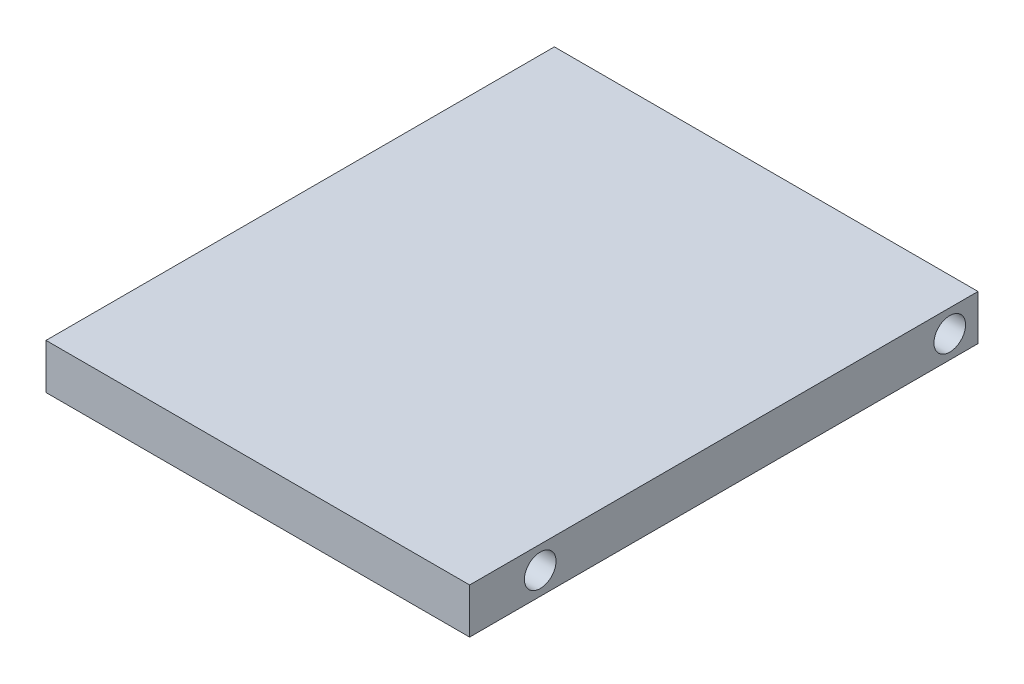
ISO-10303-21;
HEADER;
FILE_DESCRIPTION(('STEP AP214'),'2;1');
FILE_NAME('part.step','',(''),(''),'','','');
FILE_SCHEMA(('AUTOMOTIVE_DESIGN { 1 0 10303 214 1 1 1 1 }'));
ENDSEC;
DATA;
#1=APPLICATION_CONTEXT('core data for automotive mechanical design processes');
#2=APPLICATION_PROTOCOL_DEFINITION('international standard','automotive_design',2000,#1);
#3=PRODUCT_CONTEXT('',#1,'mechanical');
#4=PRODUCT('Part','Part','',(#3));
#5=PRODUCT_RELATED_PRODUCT_CATEGORY('part','',(#4));
#6=PRODUCT_DEFINITION_FORMATION('','',#4);
#7=PRODUCT_DEFINITION_CONTEXT('part definition',#1,'design');
#8=PRODUCT_DEFINITION('design','',#6,#7);
#9=PRODUCT_DEFINITION_SHAPE('','',#8);
#10=(LENGTH_UNIT() NAMED_UNIT(*) SI_UNIT(.MILLI.,.METRE.));
#11=(NAMED_UNIT(*) PLANE_ANGLE_UNIT() SI_UNIT($,.RADIAN.));
#12=(NAMED_UNIT(*) SI_UNIT($,.STERADIAN.) SOLID_ANGLE_UNIT());
#13=UNCERTAINTY_MEASURE_WITH_UNIT(LENGTH_MEASURE(1.E-05),#10,'distance_accuracy_value','');
#14=(GEOMETRIC_REPRESENTATION_CONTEXT(3) GLOBAL_UNCERTAINTY_ASSIGNED_CONTEXT((#13)) GLOBAL_UNIT_ASSIGNED_CONTEXT((#10,
#11,#12)) REPRESENTATION_CONTEXT('',''));
#15=CARTESIAN_POINT('',(0.,0.,0.));
#16=DIRECTION('',(0.,0.,1.));
#17=DIRECTION('',(1.,0.,0.));
#18=AXIS2_PLACEMENT_3D('',#15,#16,#17);
#19=CARTESIAN_POINT('',(-37.5,8.,-45.));
#20=DIRECTION('',(1.,0.,0.));
#21=DIRECTION('',(0.,0.,-1.));
#22=AXIS2_PLACEMENT_3D('',#19,#20,#21);
#23=PLANE('',#22);
#24=CARTESIAN_POINT('',(-37.5,4.,-40.));
#25=DIRECTION('',(1.,0.,0.));
#26=DIRECTION('',(0.,0.,-1.));
#27=AXIS2_PLACEMENT_3D('',#24,#25,#26);
#28=CIRCLE('',#27,2.8);
#29=CARTESIAN_POINT('',(-37.5,4.,-42.8));
#30=VERTEX_POINT('',#29);
#31=EDGE_CURVE('E152',#30,#30,#28,.T.);
#32=ORIENTED_EDGE('',*,*,#31,.T.);
#33=EDGE_LOOP('',(#32));
#34=FACE_BOUND('',#33,.T.);
#35=CARTESIAN_POINT('',(-37.5,4.,32.5));
#36=DIRECTION('',(1.,0.,0.));
#37=DIRECTION('',(0.,0.,-1.));
#38=AXIS2_PLACEMENT_3D('',#35,#36,#37);
#39=CIRCLE('',#38,2.8);
#40=CARTESIAN_POINT('',(-37.5,4.,29.7));
#41=VERTEX_POINT('',#40);
#42=EDGE_CURVE('E144',#41,#41,#39,.T.);
#43=ORIENTED_EDGE('',*,*,#42,.T.);
#44=EDGE_LOOP('',(#43));
#45=FACE_BOUND('',#44,.T.);
#46=DIRECTION('',(0.,0.,1.));
#47=VECTOR('',#46,1.);
#48=CARTESIAN_POINT('',(-37.5,0.,-45.));
#49=LINE('',#48,#47);
#50=CARTESIAN_POINT('',(-37.5,0.,-45.));
#51=VERTEX_POINT('',#50);
#52=CARTESIAN_POINT('',(-37.5,0.,45.));
#53=VERTEX_POINT('',#52);
#54=EDGE_CURVE('E107',#51,#53,#49,.T.);
#55=ORIENTED_EDGE('',*,*,#54,.T.);
#56=DIRECTION('',(0.,-1.,0.));
#57=VECTOR('',#56,1.);
#58=CARTESIAN_POINT('',(-37.5,8.,45.));
#59=LINE('',#58,#57);
#60=CARTESIAN_POINT('',(-37.5,8.,45.));
#61=VERTEX_POINT('',#60);
#62=EDGE_CURVE('E11',#61,#53,#59,.T.);
#63=ORIENTED_EDGE('',*,*,#62,.F.);
#64=DIRECTION('',(0.,0.,1.));
#65=VECTOR('',#64,1.);
#66=CARTESIAN_POINT('',(-37.5,8.,-45.));
#67=LINE('',#66,#65);
#68=CARTESIAN_POINT('',(-37.5,8.,-45.));
#69=VERTEX_POINT('',#68);
#70=EDGE_CURVE('E91',#69,#61,#67,.T.);
#71=ORIENTED_EDGE('',*,*,#70,.F.);
#72=DIRECTION('',(0.,-1.,0.));
#73=VECTOR('',#72,1.);
#74=CARTESIAN_POINT('',(-37.5,8.,-45.));
#75=LINE('',#74,#73);
#76=EDGE_CURVE('E103',#69,#51,#75,.T.);
#77=ORIENTED_EDGE('',*,*,#76,.T.);
#78=EDGE_LOOP('',(#55,#63,#71,#77));
#79=FACE_BOUND('',#78,.T.);
#80=ADVANCED_FACE('F39',(#34,#45,#79),#23,.F.);
#81=CARTESIAN_POINT('',(-37.5,8.,45.));
#82=DIRECTION('',(0.,0.,-1.));
#83=DIRECTION('',(-1.,0.,0.));
#84=AXIS2_PLACEMENT_3D('',#81,#82,#83);
#85=PLANE('',#84);
#86=DIRECTION('',(1.,0.,0.));
#87=VECTOR('',#86,1.);
#88=CARTESIAN_POINT('',(-37.5,0.,45.));
#89=LINE('',#88,#87);
#90=CARTESIAN_POINT('',(37.5,0.,45.));
#91=VERTEX_POINT('',#90);
#92=EDGE_CURVE('E96',#53,#91,#89,.T.);
#93=ORIENTED_EDGE('',*,*,#92,.T.);
#94=DIRECTION('',(0.,-1.,0.));
#95=VECTOR('',#94,1.);
#96=CARTESIAN_POINT('',(37.5,8.,45.));
#97=LINE('',#96,#95);
#98=CARTESIAN_POINT('',(37.5,8.,45.));
#99=VERTEX_POINT('',#98);
#100=EDGE_CURVE('E48',#99,#91,#97,.T.);
#101=ORIENTED_EDGE('',*,*,#100,.F.);
#102=DIRECTION('',(1.,0.,0.));
#103=VECTOR('',#102,1.);
#104=CARTESIAN_POINT('',(-37.5,8.,45.));
#105=LINE('',#104,#103);
#106=EDGE_CURVE('E86',#61,#99,#105,.T.);
#107=ORIENTED_EDGE('',*,*,#106,.F.);
#108=ORIENTED_EDGE('',*,*,#62,.T.);
#109=EDGE_LOOP('',(#93,#101,#107,#108));
#110=FACE_BOUND('',#109,.T.);
#111=ADVANCED_FACE('F95',(#110),#85,.F.);
#112=CARTESIAN_POINT('',(37.5,8.,-45.));
#113=DIRECTION('',(-1.,0.,0.));
#114=DIRECTION('',(0.,0.,1.));
#115=AXIS2_PLACEMENT_3D('',#112,#113,#114);
#116=PLANE('',#115);
#117=CARTESIAN_POINT('',(37.5,4.,-40.));
#118=DIRECTION('',(1.,0.,0.));
#119=DIRECTION('',(0.,0.,-1.));
#120=AXIS2_PLACEMENT_3D('',#117,#118,#119);
#121=CIRCLE('',#120,2.8);
#122=CARTESIAN_POINT('',(37.5,4.,-42.8));
#123=VERTEX_POINT('',#122);
#124=EDGE_CURVE('E137',#123,#123,#121,.T.);
#125=ORIENTED_EDGE('',*,*,#124,.F.);
#126=EDGE_LOOP('',(#125));
#127=FACE_BOUND('',#126,.T.);
#128=CARTESIAN_POINT('',(37.5,4.,32.5));
#129=DIRECTION('',(1.,0.,0.));
#130=DIRECTION('',(0.,0.,-1.));
#131=AXIS2_PLACEMENT_3D('',#128,#129,#130);
#132=CIRCLE('',#131,2.8);
#133=CARTESIAN_POINT('',(37.5,4.,29.7));
#134=VERTEX_POINT('',#133);
#135=EDGE_CURVE('E128',#134,#134,#132,.T.);
#136=ORIENTED_EDGE('',*,*,#135,.F.);
#137=EDGE_LOOP('',(#136));
#138=FACE_BOUND('',#137,.T.);
#139=DIRECTION('',(0.,0.,-1.));
#140=VECTOR('',#139,1.);
#141=CARTESIAN_POINT('',(37.5,0.,-45.));
#142=LINE('',#141,#140);
#143=CARTESIAN_POINT('',(37.5,0.,-45.));
#144=VERTEX_POINT('',#143);
#145=EDGE_CURVE('E73',#91,#144,#142,.T.);
#146=ORIENTED_EDGE('',*,*,#145,.T.);
#147=DIRECTION('',(0.,-1.,0.));
#148=VECTOR('',#147,1.);
#149=CARTESIAN_POINT('',(37.5,8.,-45.));
#150=LINE('',#149,#148);
#151=CARTESIAN_POINT('',(37.5,8.,-45.));
#152=VERTEX_POINT('',#151);
#153=EDGE_CURVE('E98',#152,#144,#150,.T.);
#154=ORIENTED_EDGE('',*,*,#153,.F.);
#155=DIRECTION('',(0.,0.,-1.));
#156=VECTOR('',#155,1.);
#157=CARTESIAN_POINT('',(37.5,8.,-45.));
#158=LINE('',#157,#156);
#159=EDGE_CURVE('E89',#99,#152,#158,.T.);
#160=ORIENTED_EDGE('',*,*,#159,.F.);
#161=ORIENTED_EDGE('',*,*,#100,.T.);
#162=EDGE_LOOP('',(#146,#154,#160,#161));
#163=FACE_BOUND('',#162,.T.);
#164=ADVANCED_FACE('F99',(#127,#138,#163),#116,.F.);
#165=CARTESIAN_POINT('',(-37.5,8.,-45.));
#166=DIRECTION('',(0.,0.,1.));
#167=DIRECTION('',(1.,0.,0.));
#168=AXIS2_PLACEMENT_3D('',#165,#166,#167);
#169=PLANE('',#168);
#170=DIRECTION('',(-1.,0.,0.));
#171=VECTOR('',#170,1.);
#172=CARTESIAN_POINT('',(-37.5,0.,-45.));
#173=LINE('',#172,#171);
#174=EDGE_CURVE('E79',#144,#51,#173,.T.);
#175=ORIENTED_EDGE('',*,*,#174,.T.);
#176=ORIENTED_EDGE('',*,*,#76,.F.);
#177=DIRECTION('',(-1.,0.,0.));
#178=VECTOR('',#177,1.);
#179=CARTESIAN_POINT('',(-37.5,8.,-45.));
#180=LINE('',#179,#178);
#181=EDGE_CURVE('E56',#152,#69,#180,.T.);
#182=ORIENTED_EDGE('',*,*,#181,.F.);
#183=ORIENTED_EDGE('',*,*,#153,.T.);
#184=EDGE_LOOP('',(#175,#176,#182,#183));
#185=FACE_BOUND('',#184,.T.);
#186=ADVANCED_FACE('F121',(#185),#169,.F.);
#187=CARTESIAN_POINT('',(0.,8.,0.));
#188=DIRECTION('',(0.,1.,0.));
#189=DIRECTION('',(0.,0.,1.));
#190=AXIS2_PLACEMENT_3D('',#187,#188,#189);
#191=PLANE('',#190);
#192=ORIENTED_EDGE('',*,*,#70,.T.);
#193=ORIENTED_EDGE('',*,*,#106,.T.);
#194=ORIENTED_EDGE('',*,*,#159,.T.);
#195=ORIENTED_EDGE('',*,*,#181,.T.);
#196=EDGE_LOOP('',(#192,#193,#194,#195));
#197=FACE_BOUND('',#196,.T.);
#198=ADVANCED_FACE('F87',(#197),#191,.T.);
#199=CARTESIAN_POINT('',(0.,0.,0.));
#200=DIRECTION('',(0.,1.,0.));
#201=DIRECTION('',(0.,0.,1.));
#202=AXIS2_PLACEMENT_3D('',#199,#200,#201);
#203=PLANE('',#202);
#204=ORIENTED_EDGE('',*,*,#54,.F.);
#205=ORIENTED_EDGE('',*,*,#174,.F.);
#206=ORIENTED_EDGE('',*,*,#145,.F.);
#207=ORIENTED_EDGE('',*,*,#92,.F.);
#208=EDGE_LOOP('',(#204,#205,#206,#207));
#209=FACE_BOUND('',#208,.T.);
#210=ADVANCED_FACE('F124',(#209),#203,.F.);
#211=CARTESIAN_POINT('',(32.6,4.,32.5));
#212=DIRECTION('',(1.,0.,0.));
#213=DIRECTION('',(0.,0.,-1.));
#214=AXIS2_PLACEMENT_3D('',#211,#212,#213);
#215=CYLINDRICAL_SURFACE('',#214,2.8);
#216=CARTESIAN_POINT('',(32.6,4.,32.5));
#217=DIRECTION('',(1.,0.,0.));
#218=DIRECTION('',(0.,0.,-1.));
#219=AXIS2_PLACEMENT_3D('',#216,#217,#218);
#220=CIRCLE('',#219,2.8);
#221=CARTESIAN_POINT('',(32.6,4.,29.7));
#222=VERTEX_POINT('',#221);
#223=EDGE_CURVE('E132',#222,#222,#220,.T.);
#224=ORIENTED_EDGE('',*,*,#223,.F.);
#225=EDGE_LOOP('',(#224));
#226=FACE_BOUND('',#225,.T.);
#227=ORIENTED_EDGE('',*,*,#135,.T.);
#228=EDGE_LOOP('',(#227));
#229=FACE_BOUND('',#228,.T.);
#230=ADVANCED_FACE('F201',(#226,#229),#215,.F.);
#231=CARTESIAN_POINT('',(32.6,4.,32.5));
#232=DIRECTION('',(1.,0.,0.));
#233=DIRECTION('',(0.,0.,-1.));
#234=AXIS2_PLACEMENT_3D('',#231,#232,#233);
#235=PLANE('',#234);
#236=ORIENTED_EDGE('',*,*,#223,.T.);
#237=EDGE_LOOP('',(#236));
#238=FACE_BOUND('',#237,.T.);
#239=ADVANCED_FACE('F197',(#238),#235,.T.);
#240=CARTESIAN_POINT('',(32.6,4.,-40.));
#241=DIRECTION('',(1.,0.,0.));
#242=DIRECTION('',(0.,0.,-1.));
#243=AXIS2_PLACEMENT_3D('',#240,#241,#242);
#244=CYLINDRICAL_SURFACE('',#243,2.8);
#245=CARTESIAN_POINT('',(32.6,4.,-40.));
#246=DIRECTION('',(1.,0.,0.));
#247=DIRECTION('',(0.,0.,-1.));
#248=AXIS2_PLACEMENT_3D('',#245,#246,#247);
#249=CIRCLE('',#248,2.8);
#250=CARTESIAN_POINT('',(32.6,4.,-42.8));
#251=VERTEX_POINT('',#250);
#252=EDGE_CURVE('E111',#251,#251,#249,.T.);
#253=ORIENTED_EDGE('',*,*,#252,.F.);
#254=EDGE_LOOP('',(#253));
#255=FACE_BOUND('',#254,.T.);
#256=ORIENTED_EDGE('',*,*,#124,.T.);
#257=EDGE_LOOP('',(#256));
#258=FACE_BOUND('',#257,.T.);
#259=ADVANCED_FACE('F191',(#255,#258),#244,.F.);
#260=CARTESIAN_POINT('',(32.6,4.,-40.));
#261=DIRECTION('',(1.,0.,0.));
#262=DIRECTION('',(0.,0.,-1.));
#263=AXIS2_PLACEMENT_3D('',#260,#261,#262);
#264=PLANE('',#263);
#265=ORIENTED_EDGE('',*,*,#252,.T.);
#266=EDGE_LOOP('',(#265));
#267=FACE_BOUND('',#266,.T.);
#268=ADVANCED_FACE('F182',(#267),#264,.T.);
#269=CARTESIAN_POINT('',(-32.6,4.,32.5));
#270=DIRECTION('',(-1.,0.,0.));
#271=DIRECTION('',(0.,0.,1.));
#272=AXIS2_PLACEMENT_3D('',#269,#270,#271);
#273=CYLINDRICAL_SURFACE('',#272,2.8);
#274=CARTESIAN_POINT('',(-32.6,4.,32.5));
#275=DIRECTION('',(1.,0.,0.));
#276=DIRECTION('',(0.,0.,-1.));
#277=AXIS2_PLACEMENT_3D('',#274,#275,#276);
#278=CIRCLE('',#277,2.8);
#279=CARTESIAN_POINT('',(-32.6,4.,29.7));
#280=VERTEX_POINT('',#279);
#281=EDGE_CURVE('E148',#280,#280,#278,.T.);
#282=ORIENTED_EDGE('',*,*,#281,.T.);
#283=EDGE_LOOP('',(#282));
#284=FACE_BOUND('',#283,.T.);
#285=ORIENTED_EDGE('',*,*,#42,.F.);
#286=EDGE_LOOP('',(#285));
#287=FACE_BOUND('',#286,.T.);
#288=ADVANCED_FACE('F180',(#284,#287),#273,.F.);
#289=CARTESIAN_POINT('',(-32.6,4.,32.5));
#290=DIRECTION('',(-1.,0.,0.));
#291=DIRECTION('',(0.,0.,-1.));
#292=AXIS2_PLACEMENT_3D('',#289,#290,#291);
#293=PLANE('',#292);
#294=ORIENTED_EDGE('',*,*,#281,.F.);
#295=EDGE_LOOP('',(#294));
#296=FACE_BOUND('',#295,.T.);
#297=ADVANCED_FACE('F169',(#296),#293,.T.);
#298=CARTESIAN_POINT('',(-32.6,4.,-40.));
#299=DIRECTION('',(-1.,0.,0.));
#300=DIRECTION('',(0.,0.,1.));
#301=AXIS2_PLACEMENT_3D('',#298,#299,#300);
#302=CYLINDRICAL_SURFACE('',#301,2.8);
#303=CARTESIAN_POINT('',(-32.6,4.,-40.));
#304=DIRECTION('',(1.,0.,0.));
#305=DIRECTION('',(0.,0.,-1.));
#306=AXIS2_PLACEMENT_3D('',#303,#304,#305);
#307=CIRCLE('',#306,2.8);
#308=CARTESIAN_POINT('',(-32.6,4.,-42.8));
#309=VERTEX_POINT('',#308);
#310=EDGE_CURVE('E133',#309,#309,#307,.T.);
#311=ORIENTED_EDGE('',*,*,#310,.T.);
#312=EDGE_LOOP('',(#311));
#313=FACE_BOUND('',#312,.T.);
#314=ORIENTED_EDGE('',*,*,#31,.F.);
#315=EDGE_LOOP('',(#314));
#316=FACE_BOUND('',#315,.T.);
#317=ADVANCED_FACE('F160',(#313,#316),#302,.F.);
#318=CARTESIAN_POINT('',(-32.6,4.,-40.));
#319=DIRECTION('',(-1.,0.,0.));
#320=DIRECTION('',(0.,0.,-1.));
#321=AXIS2_PLACEMENT_3D('',#318,#319,#320);
#322=PLANE('',#321);
#323=ORIENTED_EDGE('',*,*,#310,.F.);
#324=EDGE_LOOP('',(#323));
#325=FACE_BOUND('',#324,.T.);
#326=ADVANCED_FACE('F163',(#325),#322,.T.);
#327=CLOSED_SHELL('',(#80,#111,#164,#186,#198,#210,#230,#239,#259,#268,#288,#297,#317,#326));
#328=MANIFOLD_SOLID_BREP('B2',#327);
#329=ADVANCED_BREP_SHAPE_REPRESENTATION('',(#18,#328),#14);
#330=SHAPE_DEFINITION_REPRESENTATION(#9,#329);
ENDSEC;
END-ISO-10303-21;
